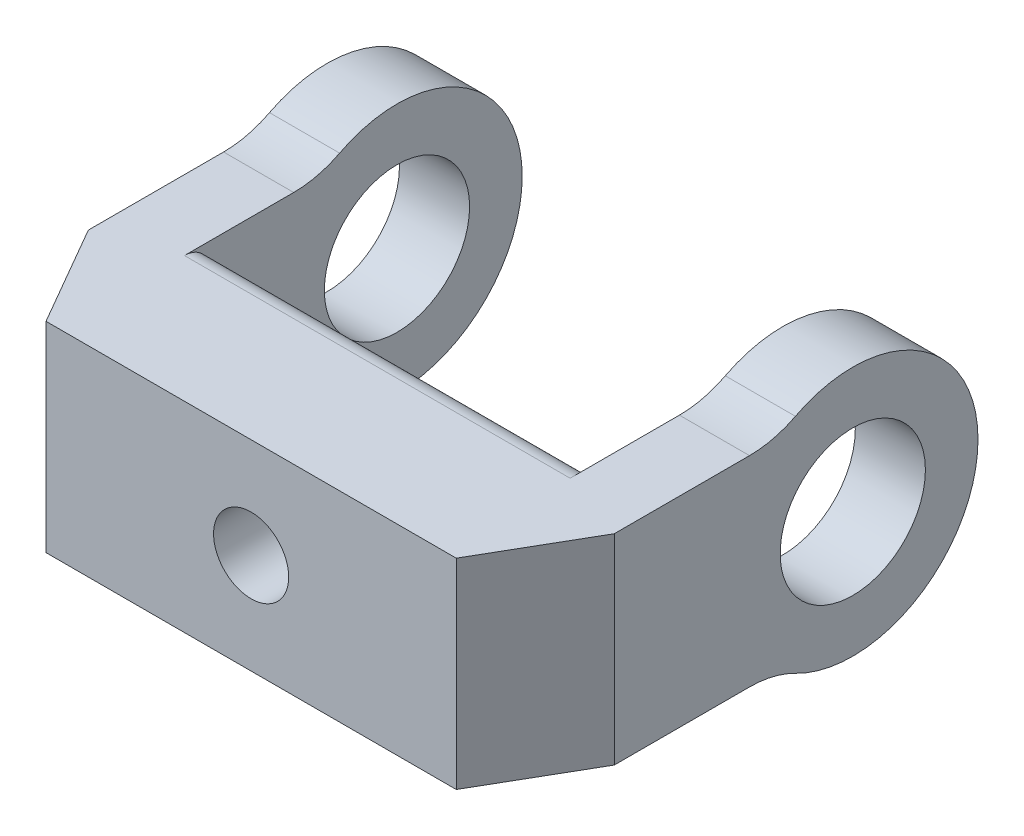
ISO-10303-21;
HEADER;
FILE_DESCRIPTION(('STEP AP214'),'2;1');
FILE_NAME('part.step','',(''),(''),'','','');
FILE_SCHEMA(('AUTOMOTIVE_DESIGN { 1 0 10303 214 1 1 1 1 }'));
ENDSEC;
DATA;
#1=APPLICATION_CONTEXT('core data for automotive mechanical design processes');
#2=APPLICATION_PROTOCOL_DEFINITION('international standard','automotive_design',2000,#1);
#3=PRODUCT_CONTEXT('',#1,'mechanical');
#4=PRODUCT('Part','Part','',(#3));
#5=PRODUCT_RELATED_PRODUCT_CATEGORY('part','',(#4));
#6=PRODUCT_DEFINITION_FORMATION('','',#4);
#7=PRODUCT_DEFINITION_CONTEXT('part definition',#1,'design');
#8=PRODUCT_DEFINITION('design','',#6,#7);
#9=PRODUCT_DEFINITION_SHAPE('','',#8);
#10=(LENGTH_UNIT() NAMED_UNIT(*) SI_UNIT(.MILLI.,.METRE.));
#11=(NAMED_UNIT(*) PLANE_ANGLE_UNIT() SI_UNIT($,.RADIAN.));
#12=(NAMED_UNIT(*) SI_UNIT($,.STERADIAN.) SOLID_ANGLE_UNIT());
#13=UNCERTAINTY_MEASURE_WITH_UNIT(LENGTH_MEASURE(1.E-05),#10,'distance_accuracy_value','');
#14=(GEOMETRIC_REPRESENTATION_CONTEXT(3) GLOBAL_UNCERTAINTY_ASSIGNED_CONTEXT((#13)) GLOBAL_UNIT_ASSIGNED_CONTEXT((#10,
#11,#12)) REPRESENTATION_CONTEXT('',''));
#15=CARTESIAN_POINT('',(0.,0.,0.));
#16=DIRECTION('',(0.,0.,1.));
#17=DIRECTION('',(1.,0.,0.));
#18=AXIS2_PLACEMENT_3D('',#15,#16,#17);
#19=CARTESIAN_POINT('',(0.,4.,-0.2));
#20=DIRECTION('',(0.,0.,1.));
#21=DIRECTION('',(1.,0.,0.));
#22=AXIS2_PLACEMENT_3D('',#19,#20,#21);
#23=CYLINDRICAL_SURFACE('',#22,2.75);
#24=CARTESIAN_POINT('',(0.,4.,-0.2));
#25=DIRECTION('',(0.,0.,-1.));
#26=DIRECTION('',(-1.,0.,0.));
#27=AXIS2_PLACEMENT_3D('',#24,#25,#26);
#28=CIRCLE('',#27,2.75);
#29=CARTESIAN_POINT('',(-2.75,4.,-0.2));
#30=VERTEX_POINT('',#29);
#31=EDGE_CURVE('E11',#30,#30,#28,.T.);
#32=ORIENTED_EDGE('',*,*,#31,.F.);
#33=EDGE_LOOP('',(#32));
#34=FACE_BOUND('',#33,.T.);
#35=CARTESIAN_POINT('',(0.,4.,2.8));
#36=DIRECTION('',(0.,0.,-1.));
#37=DIRECTION('',(-1.,0.,0.));
#38=AXIS2_PLACEMENT_3D('',#35,#36,#37);
#39=CIRCLE('',#38,2.75);
#40=CARTESIAN_POINT('',(-2.75,4.,2.8));
#41=VERTEX_POINT('',#40);
#42=EDGE_CURVE('E47',#41,#41,#39,.T.);
#43=ORIENTED_EDGE('',*,*,#42,.T.);
#44=EDGE_LOOP('',(#43));
#45=FACE_BOUND('',#44,.T.);
#46=ADVANCED_FACE('F44',(#34,#45),#23,.T.);
#47=CARTESIAN_POINT('',(0.,4.,-0.2));
#48=DIRECTION('',(0.,0.,-1.));
#49=DIRECTION('',(-1.,0.,0.));
#50=AXIS2_PLACEMENT_3D('',#47,#48,#49);
#51=PLANE('',#50);
#52=ORIENTED_EDGE('',*,*,#31,.T.);
#53=EDGE_LOOP('',(#52));
#54=FACE_BOUND('',#53,.T.);
#55=ADVANCED_FACE('F59',(#54),#51,.T.);
#56=CARTESIAN_POINT('',(0.,4.,2.8));
#57=DIRECTION('',(0.,0.,-1.));
#58=DIRECTION('',(-1.,0.,0.));
#59=AXIS2_PLACEMENT_3D('',#56,#57,#58);
#60=PLANE('',#59);
#61=ORIENTED_EDGE('',*,*,#42,.F.);
#62=EDGE_LOOP('',(#61));
#63=FACE_BOUND('',#62,.T.);
#64=ADVANCED_FACE('F57',(#63),#60,.F.);
#65=CLOSED_SHELL('',(#46,#55,#64));
#66=MANIFOLD_SOLID_BREP('B2_NOT_SHOWN',#65);
#67=CARTESIAN_POINT('',(-30.3274169979695,4.,-8.26168224299066));
#68=DIRECTION('',(1.,0.,0.));
#69=DIRECTION('',(0.,1.,0.));
#70=AXIS2_PLACEMENT_3D('',#67,#68,#69);
#71=CYLINDRICAL_SURFACE('',#70,8.);
#72=DIRECTION('',(1.,0.,0.));
#73=VECTOR('',#72,1.);
#74=CARTESIAN_POINT('',(-30.3274169979695,1.33333333333333,-0.719209910334148));
#75=LINE('',#74,#73);
#76=CARTESIAN_POINT('',(7.7,1.33333333333333,-0.719209910334148));
#77=VERTEX_POINT('',#76);
#78=CARTESIAN_POINT('',(1.37436854187254,1.33333333333333,-0.719209910334148));
#79=VERTEX_POINT('',#78);
#80=EDGE_CURVE('E230',#77,#79,#75,.F.);
#81=ORIENTED_EDGE('',*,*,#80,.T.);
#82=CARTESIAN_POINT('',(1.37436854187254,1.33333333333333,-0.719209910334148));
#83=CARTESIAN_POINT('',(1.45064290726916,1.37264778918805,-0.705313533831332));
#84=CARTESIAN_POINT('',(1.52507345791157,1.41514848642053,-0.690629883747213));
#85=CARTESIAN_POINT('',(1.66985701040067,1.50622775321314,-0.660141524678702));
#86=CARTESIAN_POINT('',(1.74021078030644,1.55480517244527,-0.644337028115957));
#87=CARTESIAN_POINT('',(1.9445595961458,1.70919341075781,-0.595926813772505));
#88=CARTESIAN_POINT('',(2.0719042774192,1.82369238638995,-0.562312435107317));
#89=CARTESIAN_POINT('',(2.30540710016194,2.07275487158565,-0.496225673168583));
#90=CARTESIAN_POINT('',(2.41156439899211,2.20731917879181,-0.463753335357209));
#91=CARTESIAN_POINT('',(2.59981347019681,2.49327301226783,-0.403497068007899));
#92=CARTESIAN_POINT('',(2.68191615915642,2.64465486316091,-0.375711014153892));
#93=CARTESIAN_POINT('',(2.81857674908921,2.95855947711137,-0.328190076092195));
#94=CARTESIAN_POINT('',(2.87342984956449,3.12094016765439,-0.30836937221502));
#95=CARTESIAN_POINT('',(2.95476735388555,3.45353628678804,-0.278625305635224));
#96=CARTESIAN_POINT('',(2.98126096727326,3.62374915319582,-0.268698729956904));
#97=CARTESIAN_POINT('',(3.00403656121541,3.95635334184611,-0.260173436898311));
#98=CARTESIAN_POINT('',(3.00200622093649,4.11861479202222,-0.260941898829235));
#99=CARTESIAN_POINT('',(2.97190203232772,4.44033080807695,-0.272188698326985));
#100=CARTESIAN_POINT('',(2.94383228134689,4.5997858115329,-0.282665508267167));
#101=CARTESIAN_POINT('',(2.86350944241337,4.90845499048188,-0.311944574667899));
#102=CARTESIAN_POINT('',(2.81171304662283,5.05780399505034,-0.330589330542769));
#103=CARTESIAN_POINT('',(2.68580784626588,5.34578998955048,-0.37434489269206));
#104=CARTESIAN_POINT('',(2.6116897343148,5.48442248070549,-0.399458395577199));
#105=CARTESIAN_POINT('',(2.43931228231947,5.75400812866875,-0.455064145225351));
#106=CARTESIAN_POINT('',(2.34009002921476,5.88430371306484,-0.485752309136465));
#107=CARTESIAN_POINT('',(2.12206030693523,6.12683258569819,-0.548558441442815));
#108=CARTESIAN_POINT('',(2.00326467655595,6.23907671161018,-0.580675537041019));
#109=CARTESIAN_POINT('',(1.79826649447429,6.40337295411356,-0.630950100888449));
#110=CARTESIAN_POINT('',(1.71729765586254,6.46188376059561,-0.649689630422438));
#111=CARTESIAN_POINT('',(1.54983807656989,6.57059317792502,-0.685713307382543));
#112=CARTESIAN_POINT('',(1.46335577686488,6.62080409145845,-0.702999589878367));
#113=CARTESIAN_POINT('',(1.37436854187257,6.66666666666666,-0.719209910334146));
#114=B_SPLINE_CURVE_WITH_KNOTS('',3,(#82,#83,#84,#85,#86,#87,#88,#89,#90,#91,#92,#93,#94,#95,
#96,#97,#98,#99,#100,#101,#102,#103,#104,#105,#106,#107,#108,#109,#110,#111,#112,#113),
.UNSPECIFIED.,.F.,.F.,(4,2,2,2,2,2,2,2,2,2,2,2,2,2,2,4),(0.,0.260607391352915,0.521165523976634,
1.04207157785956,1.56299834446671,2.08368833394413,2.59860740439107,3.11335920775131,
3.59778973762481,4.0821440543933,4.55754370124373,5.03314184841986,5.53087207243193,
6.02830234617353,6.33276425069645,6.63677073298552),.UNSPECIFIED.);
#115=CARTESIAN_POINT('',(1.37436854187257,6.66666666666666,-0.719209910334145));
#116=VERTEX_POINT('',#115);
#117=EDGE_CURVE('E213',#79,#116,#114,.T.);
#118=ORIENTED_EDGE('',*,*,#117,.T.);
#119=DIRECTION('',(1.,0.,0.));
#120=VECTOR('',#119,1.);
#121=CARTESIAN_POINT('',(-30.3274169979695,6.66666666666667,-0.719209910334146));
#122=LINE('',#121,#120);
#123=CARTESIAN_POINT('',(7.7,6.66666666666666,-0.719209910334146));
#124=VERTEX_POINT('',#123);
#125=EDGE_CURVE('E227',#116,#124,#122,.T.);
#126=ORIENTED_EDGE('',*,*,#125,.T.);
#127=CARTESIAN_POINT('',(7.7,3.99999999999999,-8.26168224299066));
#128=DIRECTION('',(-1.,0.,0.));
#129=DIRECTION('',(0.,-1.,0.));
#130=AXIS2_PLACEMENT_3D('',#127,#128,#129);
#131=CIRCLE('',#130,8.);
#132=EDGE_CURVE('E353',#77,#124,#131,.T.);
#133=ORIENTED_EDGE('',*,*,#132,.F.);
#134=EDGE_LOOP('',(#81,#118,#126,#133));
#135=FACE_BOUND('',#134,.T.);
#136=ADVANCED_FACE('F85',(#135),#71,.F.);
#137=CARTESIAN_POINT('',(-7.7,6.66666666666666,-0.719209910334146));
#138=VERTEX_POINT('',#137);
#139=CARTESIAN_POINT('',(-1.37436854187256,6.66666666666666,-0.719209910334146));
#140=VERTEX_POINT('',#139);
#141=EDGE_CURVE('E238',#138,#140,#122,.T.);
#142=ORIENTED_EDGE('',*,*,#141,.T.);
#143=CARTESIAN_POINT('',(-1.37436854187256,6.66666666666666,-0.719209910334146));
#144=CARTESIAN_POINT('',(-1.45064290726918,6.62735221081193,-0.705313533831328));
#145=CARTESIAN_POINT('',(-1.52507345791159,6.58485151357945,-0.690629883747208));
#146=CARTESIAN_POINT('',(-1.66985701040069,6.49377224678684,-0.660141524678699));
#147=CARTESIAN_POINT('',(-1.74021078030646,6.44519482755471,-0.644337028115954));
#148=CARTESIAN_POINT('',(-1.94455959614581,6.29080658924217,-0.595926813772502));
#149=CARTESIAN_POINT('',(-2.07190427741922,6.17630761361003,-0.562312435107312));
#150=CARTESIAN_POINT('',(-2.30540710016195,5.92724512841432,-0.496225673168579));
#151=CARTESIAN_POINT('',(-2.41156439899213,5.79268082120817,-0.463753335357205));
#152=CARTESIAN_POINT('',(-2.59981347019682,5.50672698773214,-0.403497068007895));
#153=CARTESIAN_POINT('',(-2.68191615915643,5.35534513683906,-0.375711014153887));
#154=CARTESIAN_POINT('',(-2.81857674908921,5.0414405228886,-0.32819007609219));
#155=CARTESIAN_POINT('',(-2.8734298495645,4.87905983234558,-0.308369372215017));
#156=CARTESIAN_POINT('',(-2.95476735388555,4.54646371321193,-0.278625305635224));
#157=CARTESIAN_POINT('',(-2.98126096727326,4.37625084680415,-0.268698729956905));
#158=CARTESIAN_POINT('',(-3.0040365612154,4.04364665815386,-0.260173436898313));
#159=CARTESIAN_POINT('',(-3.00200622093648,3.88138520797775,-0.260941898829237));
#160=CARTESIAN_POINT('',(-2.97190203232771,3.55966919192302,-0.272188698326989));
#161=CARTESIAN_POINT('',(-2.94383228134688,3.40021418846707,-0.282665508267171));
#162=CARTESIAN_POINT('',(-2.86350944241335,3.0915450095181,-0.311944574667903));
#163=CARTESIAN_POINT('',(-2.81171304662281,2.94219600494963,-0.330589330542772));
#164=CARTESIAN_POINT('',(-2.68580784626586,2.65421001044949,-0.374344892692062));
#165=CARTESIAN_POINT('',(-2.61168973431478,2.51557751929448,-0.399458395577203));
#166=CARTESIAN_POINT('',(-2.43931228231945,2.24599187133123,-0.455064145225356));
#167=CARTESIAN_POINT('',(-2.34009002921474,2.11569628693514,-0.48575230913647));
#168=CARTESIAN_POINT('',(-2.1220603069352,1.87316741430179,-0.548558441442818));
#169=CARTESIAN_POINT('',(-2.00326467655593,1.7609232883898,-0.580675537041022));
#170=CARTESIAN_POINT('',(-1.79826649447425,1.59662704588642,-0.630950100888452));
#171=CARTESIAN_POINT('',(-1.71729765586251,1.53811623940438,-0.649689630422442));
#172=CARTESIAN_POINT('',(-1.54983807656986,1.42940682207496,-0.685713307382548));
#173=CARTESIAN_POINT('',(-1.46335577686485,1.37919590854153,-0.702999589878372));
#174=CARTESIAN_POINT('',(-1.37436854187254,1.33333333333333,-0.719209910334149));
#175=B_SPLINE_CURVE_WITH_KNOTS('',3,(#143,#144,#145,#146,#147,#148,#149,#150,#151,#152,#153,
#154,#155,#156,#157,#158,#159,#160,#161,#162,#163,#164,#165,#166,#167,#168,#169,#170,#171,#172,
#173,#174),.UNSPECIFIED.,.F.,.F.,(4,2,2,2,2,2,2,2,2,2,2,2,2,2,2,4),(0.,0.260607391352916,
0.521165523976635,1.04207157785956,1.56299834446671,2.08368833394413,2.59860740439108,
3.11335920775131,3.5977897376248,4.08214405439329,4.55754370124373,5.03314184841986,
5.53087207243193,6.02830234617353,6.33276425069645,6.63677073298553),.UNSPECIFIED.);
#176=CARTESIAN_POINT('',(-1.37436854187254,1.33333333333333,-0.719209910334148));
#177=VERTEX_POINT('',#176);
#178=EDGE_CURVE('E216',#140,#177,#175,.T.);
#179=ORIENTED_EDGE('',*,*,#178,.T.);
#180=CARTESIAN_POINT('',(-7.7,1.33333333333333,-0.719209910334148));
#181=VERTEX_POINT('',#180);
#182=EDGE_CURVE('E241',#177,#181,#75,.F.);
#183=ORIENTED_EDGE('',*,*,#182,.T.);
#184=CARTESIAN_POINT('',(-7.7,4.,-8.26168224299066));
#185=DIRECTION('',(-1.,0.,0.));
#186=DIRECTION('',(0.,0.,1.));
#187=AXIS2_PLACEMENT_3D('',#184,#185,#186);
#188=CIRCLE('',#187,8.);
#189=EDGE_CURVE('E348',#181,#138,#188,.T.);
#190=ORIENTED_EDGE('',*,*,#189,.T.);
#191=EDGE_LOOP('',(#142,#179,#183,#190));
#192=FACE_BOUND('',#191,.T.);
#193=ADVANCED_FACE('F304',(#192),#71,.F.);
#194=CARTESIAN_POINT('',(-30.3274169979695,1.,0.223599131247915));
#195=DIRECTION('',(1.,0.,0.));
#196=DIRECTION('',(0.,1.,0.));
#197=AXIS2_PLACEMENT_3D('',#194,#195,#196);
#198=CYLINDRICAL_SURFACE('',#197,1.);
#199=ORIENTED_EDGE('',*,*,#182,.F.);
#200=CARTESIAN_POINT('',(-1.37436854187254,1.33333333333333,-0.719209910334148));
#201=CARTESIAN_POINT('',(-1.34383093339248,1.31759348896181,-0.724771788693334));
#202=CARTESIAN_POINT('',(-1.31294254777848,1.30233913486402,-0.729725033961236));
#203=CARTESIAN_POINT('',(-1.25054428149426,1.27285346975205,-0.738580153536468));
#204=CARTESIAN_POINT('',(-1.21903459686126,1.25862184241912,-0.742482353956093));
#205=CARTESIAN_POINT('',(-1.12375538851866,1.2175638991892,-0.752855750174692));
#206=CARTESIAN_POINT('',(-1.0591483139847,1.19232941861632,-0.758008628039157));
#207=CARTESIAN_POINT('',(-0.9284343067971,1.14644144372705,-0.765892881860939));
#208=CARTESIAN_POINT('',(-0.862332713786548,1.12577382995788,-0.768631801862698));
#209=CARTESIAN_POINT('',(-0.728794428754367,1.08904558368088,-0.772599622694828));
#210=CARTESIAN_POINT('',(-0.661357249144274,1.07298666811425,-0.77382796132611));
#211=CARTESIAN_POINT('',(-0.521124049966809,1.04468742008785,-0.775509196421391));
#212=CARTESIAN_POINT('',(-0.448263848874995,1.03276178906302,-0.775906714079151));
#213=CARTESIAN_POINT('',(-0.301860866979945,1.01431347508757,-0.776340926680994));
#214=CARTESIAN_POINT('',(-0.228318064477247,1.00779096449765,-0.776377610114793));
#215=CARTESIAN_POINT('',(-0.0807809906604971,1.00017617497867,-0.776408259046013));
#216=CARTESIAN_POINT('',(-0.00678606942832134,0.999096448226243,-0.776402125877105));
#217=CARTESIAN_POINT('',(0.141080673630081,1.00240666010918,-0.776399046871483));
#218=CARTESIAN_POINT('',(0.214952492832866,1.00679671385599,-0.776402101228123));
#219=CARTESIAN_POINT('',(0.372666615055302,1.02203802921477,-0.776192161182604));
#220=CARTESIAN_POINT('',(0.456429780761182,1.03372080706698,-0.775948320322494));
#221=CARTESIAN_POINT('',(0.622703908795433,1.06412107231519,-0.774458725203348));
#222=CARTESIAN_POINT('',(0.70521427316135,1.08284181552417,-0.773212506932859));
#223=CARTESIAN_POINT('',(0.867994329025678,1.12707918807268,-0.768542014479608));
#224=CARTESIAN_POINT('',(0.948271382430035,1.15256955567344,-0.765126087569134));
#225=CARTESIAN_POINT('',(1.106132570922,1.21010621753436,-0.754517352551756));
#226=CARTESIAN_POINT('',(1.18371992171641,1.24214434345826,-0.747329232911614));
#227=CARTESIAN_POINT('',(1.2788850561262,1.28616288207954,-0.734626659730996));
#228=CARTESIAN_POINT('',(1.29816228041298,1.29533183513767,-0.731845928067095));
#229=CARTESIAN_POINT('',(1.33646056184725,1.31405015951348,-0.725858322582068));
#230=CARTESIAN_POINT('',(1.35548165525823,1.32359947620446,-0.722651509800056));
#231=CARTESIAN_POINT('',(1.37436854187267,1.33333333333333,-0.719209910335116));
#232=B_SPLINE_CURVE_WITH_KNOTS('',3,(#200,#201,#202,#203,#204,#205,#206,#207,#208,#209,#210,
#211,#212,#213,#214,#215,#216,#217,#218,#219,#220,#221,#222,#223,#224,#225,#226,#227,#228,#229,
#230,#231),.UNSPECIFIED.,.F.,.F.,(4,2,2,2,2,2,2,2,2,2,2,2,2,2,2,4),(0.,0.104382478785225,
0.208732532954638,0.417135285757512,0.624884409858492,0.832710829402461,1.05399824368181,
1.27529271680504,1.49709730766674,1.71890656648106,1.9723210753254,2.22585296007386,
2.47841531999718,2.73066451048409,2.79523900425507,2.85980425722998),.UNSPECIFIED.);
#233=EDGE_CURVE('E231',#177,#79,#232,.T.);
#234=ORIENTED_EDGE('',*,*,#233,.T.);
#235=ORIENTED_EDGE('',*,*,#80,.F.);
#236=CARTESIAN_POINT('',(7.7,0.999999999999992,0.223599131247915));
#237=DIRECTION('',(1.,0.,0.));
#238=DIRECTION('',(0.,1.,0.));
#239=AXIS2_PLACEMENT_3D('',#236,#237,#238);
#240=CIRCLE('',#239,1.);
#241=CARTESIAN_POINT('',(7.7,0.,0.223599131247915));
#242=VERTEX_POINT('',#241);
#243=EDGE_CURVE('E251',#242,#77,#240,.T.);
#244=ORIENTED_EDGE('',*,*,#243,.F.);
#245=DIRECTION('',(1.,0.,0.));
#246=VECTOR('',#245,1.);
#247=CARTESIAN_POINT('',(0.,0.,0.223599131247915));
#248=LINE('',#247,#246);
#249=CARTESIAN_POINT('',(-7.7,0.,0.223599131247915));
#250=VERTEX_POINT('',#249);
#251=EDGE_CURVE('E239',#250,#242,#248,.T.);
#252=ORIENTED_EDGE('',*,*,#251,.F.);
#253=CARTESIAN_POINT('',(-7.7,0.999999999999995,0.223599131247915));
#254=DIRECTION('',(-1.,0.,0.));
#255=DIRECTION('',(0.,0.,1.));
#256=AXIS2_PLACEMENT_3D('',#253,#254,#255);
#257=CIRCLE('',#256,1.);
#258=EDGE_CURVE('E253',#181,#250,#257,.T.);
#259=ORIENTED_EDGE('',*,*,#258,.F.);
#260=EDGE_LOOP('',(#199,#234,#235,#244,#252,#259));
#261=FACE_BOUND('',#260,.T.);
#262=ADVANCED_FACE('F334',(#261),#198,.T.);
#263=CARTESIAN_POINT('',(-30.3274169979695,7.,0.223599131247918));
#264=DIRECTION('',(1.,0.,0.));
#265=DIRECTION('',(0.,1.,0.));
#266=AXIS2_PLACEMENT_3D('',#263,#264,#265);
#267=CYLINDRICAL_SURFACE('',#266,1.);
#268=ORIENTED_EDGE('',*,*,#125,.F.);
#269=CARTESIAN_POINT('',(1.37436854187257,6.66666666666666,-0.719209910334145));
#270=CARTESIAN_POINT('',(1.34383093339251,6.68240651103818,-0.72477178869333));
#271=CARTESIAN_POINT('',(1.31294254777851,6.69766086513597,-0.729725033961232));
#272=CARTESIAN_POINT('',(1.2505442814943,6.72714653024794,-0.738580153536464));
#273=CARTESIAN_POINT('',(1.2190345968613,6.74137815758087,-0.742482353956089));
#274=CARTESIAN_POINT('',(1.1237553885187,6.78243610081079,-0.752855750174689));
#275=CARTESIAN_POINT('',(1.05914831398474,6.80767058138367,-0.758008628039154));
#276=CARTESIAN_POINT('',(0.928434306797141,6.85355855627294,-0.765892881860936));
#277=CARTESIAN_POINT('',(0.86233271378659,6.87422617004211,-0.768631801862695));
#278=CARTESIAN_POINT('',(0.728794428754411,6.91095441631911,-0.772599622694825));
#279=CARTESIAN_POINT('',(0.661357249144318,6.92701333188574,-0.773827961326108));
#280=CARTESIAN_POINT('',(0.521124049966855,6.95531257991214,-0.775509196421388));
#281=CARTESIAN_POINT('',(0.448263848875042,6.96723821093697,-0.775906714079148));
#282=CARTESIAN_POINT('',(0.301860866979993,6.98568652491242,-0.776340926680991));
#283=CARTESIAN_POINT('',(0.228318064477296,6.99220903550235,-0.77637761011479));
#284=CARTESIAN_POINT('',(0.0807809906605467,6.99982382502133,-0.776408259046009));
#285=CARTESIAN_POINT('',(0.00678606942837144,7.00090355177376,-0.776402125877101));
#286=CARTESIAN_POINT('',(-0.14108067363003,6.99759333989082,-0.77639904687148));
#287=CARTESIAN_POINT('',(-0.214952492832815,6.99320328614401,-0.776402101228119));
#288=CARTESIAN_POINT('',(-0.37266661505525,6.97796197078523,-0.776192161182601));
#289=CARTESIAN_POINT('',(-0.456429780761131,6.96627919293303,-0.775948320322492));
#290=CARTESIAN_POINT('',(-0.622703908795383,6.93587892768482,-0.774458725203347));
#291=CARTESIAN_POINT('',(-0.705214273161299,6.91715818447584,-0.773212506932858));
#292=CARTESIAN_POINT('',(-0.867994329025627,6.87292081192733,-0.768542014479608));
#293=CARTESIAN_POINT('',(-0.948271382429985,6.84743044432657,-0.765126087569134));
#294=CARTESIAN_POINT('',(-1.10613257092195,6.78989378246565,-0.754517352551759));
#295=CARTESIAN_POINT('',(-1.18371992171636,6.75785565654176,-0.747329232911619));
#296=CARTESIAN_POINT('',(-1.27888505612617,6.71383711792047,-0.734626659731));
#297=CARTESIAN_POINT('',(-1.29816228041296,6.70466816486234,-0.731845928067099));
#298=CARTESIAN_POINT('',(-1.33646056184725,6.68594984048652,-0.725858322582068));
#299=CARTESIAN_POINT('',(-1.35548165525824,6.67640052379554,-0.722651509800055));
#300=CARTESIAN_POINT('',(-1.37436854187269,6.66666666666666,-0.719209910335113));
#301=B_SPLINE_CURVE_WITH_KNOTS('',3,(#269,#270,#271,#272,#273,#274,#275,#276,#277,#278,#279,
#280,#281,#282,#283,#284,#285,#286,#287,#288,#289,#290,#291,#292,#293,#294,#295,#296,#297,#298,
#299,#300),.UNSPECIFIED.,.F.,.F.,(4,2,2,2,2,2,2,2,2,2,2,2,2,2,2,4),(0.,0.104382478785225,
0.208732532954635,0.417135285757508,0.624884409858485,0.832710829402453,1.0539982436818,
1.27529271680503,1.49709730766673,1.71890656648104,1.97232107532539,2.22585296007385,
2.47841531999717,2.73066451048408,2.7952390042551,2.85980425723004),.UNSPECIFIED.);
#302=EDGE_CURVE('E209',#116,#140,#301,.T.);
#303=ORIENTED_EDGE('',*,*,#302,.T.);
#304=ORIENTED_EDGE('',*,*,#141,.F.);
#305=CARTESIAN_POINT('',(-7.7,6.99999999999999,0.223599131247918));
#306=DIRECTION('',(-1.,0.,0.));
#307=DIRECTION('',(0.,0.,1.));
#308=AXIS2_PLACEMENT_3D('',#305,#306,#307);
#309=CIRCLE('',#308,1.);
#310=CARTESIAN_POINT('',(-7.7,8.,0.223599131247918));
#311=VERTEX_POINT('',#310);
#312=EDGE_CURVE('E222',#311,#138,#309,.T.);
#313=ORIENTED_EDGE('',*,*,#312,.F.);
#314=DIRECTION('',(-1.,0.,0.));
#315=VECTOR('',#314,1.);
#316=CARTESIAN_POINT('',(-7.7,8.,0.223599131247918));
#317=LINE('',#316,#315);
#318=CARTESIAN_POINT('',(7.7,8.,0.223599131247918));
#319=VERTEX_POINT('',#318);
#320=EDGE_CURVE('E248',#319,#311,#317,.T.);
#321=ORIENTED_EDGE('',*,*,#320,.F.);
#322=CARTESIAN_POINT('',(7.7,6.99999999999999,0.223599131247918));
#323=DIRECTION('',(1.,0.,0.));
#324=DIRECTION('',(0.,1.,0.));
#325=AXIS2_PLACEMENT_3D('',#322,#323,#324);
#326=CIRCLE('',#325,1.);
#327=EDGE_CURVE('E236',#124,#319,#326,.T.);
#328=ORIENTED_EDGE('',*,*,#327,.F.);
#329=EDGE_LOOP('',(#268,#303,#304,#313,#321,#328));
#330=FACE_BOUND('',#329,.T.);
#331=ADVANCED_FACE('F233',(#330),#267,.T.);
#332=CARTESIAN_POINT('',(0.,8.,0.));
#333=DIRECTION('',(0.,-1.,0.));
#334=DIRECTION('',(0.,0.,-1.));
#335=AXIS2_PLACEMENT_3D('',#332,#333,#334);
#336=PLANE('',#335);
#337=DIRECTION('',(0.,0.,1.));
#338=VECTOR('',#337,1.);
#339=CARTESIAN_POINT('',(-7.7,8.,-12.2616822429907));
#340=LINE('',#339,#338);
#341=CARTESIAN_POINT('',(-7.7,8.,-4.13857661737299));
#342=VERTEX_POINT('',#341);
#343=EDGE_CURVE('E374',#342,#311,#340,.T.);
#344=ORIENTED_EDGE('',*,*,#343,.F.);
#345=DIRECTION('',(-1.,0.,0.));
#346=VECTOR('',#345,1.);
#347=CARTESIAN_POINT('',(0.,8.,-4.13857661737299));
#348=LINE('',#347,#346);
#349=CARTESIAN_POINT('',(-10.5,8.,-4.13857661737299));
#350=VERTEX_POINT('',#349);
#351=EDGE_CURVE('E610',#342,#350,#348,.T.);
#352=ORIENTED_EDGE('',*,*,#351,.T.);
#353=DIRECTION('',(0.,0.,1.));
#354=VECTOR('',#353,1.);
#355=CARTESIAN_POINT('',(-10.5,8.,2.26168224299065));
#356=LINE('',#355,#354);
#357=CARTESIAN_POINT('',(-10.5,8.,1.26168224299063));
#358=VERTEX_POINT('',#357);
#359=EDGE_CURVE('E243',#350,#358,#356,.T.);
#360=ORIENTED_EDGE('',*,*,#359,.T.);
#361=DIRECTION('',(0.499999999999998,0.,0.86602540378444));
#362=VECTOR('',#361,1.);
#363=CARTESIAN_POINT('',(-8.19059892324149,8.,5.26168224299065));
#364=LINE('',#363,#362);
#365=CARTESIAN_POINT('',(-8.19059892324148,8.,5.26168224299065));
#366=VERTEX_POINT('',#365);
#367=EDGE_CURVE('E666',#358,#366,#364,.T.);
#368=ORIENTED_EDGE('',*,*,#367,.T.);
#369=DIRECTION('',(-1.,0.,0.));
#370=VECTOR('',#369,1.);
#371=CARTESIAN_POINT('',(10.5,8.,5.26168224299065));
#372=LINE('',#371,#370);
#373=CARTESIAN_POINT('',(8.1905989232415,8.,5.26168224299065));
#374=VERTEX_POINT('',#373);
#375=EDGE_CURVE('E358',#374,#366,#372,.T.);
#376=ORIENTED_EDGE('',*,*,#375,.F.);
#377=DIRECTION('',(0.499999999999998,0.,-0.86602540378444));
#378=VECTOR('',#377,1.);
#379=CARTESIAN_POINT('',(8.1905989232415,8.,5.26168224299065));
#380=LINE('',#379,#378);
#381=CARTESIAN_POINT('',(10.5,8.,1.26168224299063));
#382=VERTEX_POINT('',#381);
#383=EDGE_CURVE('E670',#374,#382,#380,.T.);
#384=ORIENTED_EDGE('',*,*,#383,.T.);
#385=DIRECTION('',(0.,0.,-1.));
#386=VECTOR('',#385,1.);
#387=CARTESIAN_POINT('',(10.5,8.,2.26168224299065));
#388=LINE('',#387,#386);
#389=CARTESIAN_POINT('',(10.5,8.,-4.13857661737299));
#390=VERTEX_POINT('',#389);
#391=EDGE_CURVE('E377',#382,#390,#388,.T.);
#392=ORIENTED_EDGE('',*,*,#391,.T.);
#393=DIRECTION('',(1.,0.,0.));
#394=VECTOR('',#393,1.);
#395=CARTESIAN_POINT('',(0.,8.,-4.13857661737299));
#396=LINE('',#395,#394);
#397=CARTESIAN_POINT('',(7.7,8.,-4.138576617373));
#398=VERTEX_POINT('',#397);
#399=EDGE_CURVE('E608',#390,#398,#396,.F.);
#400=ORIENTED_EDGE('',*,*,#399,.T.);
#401=DIRECTION('',(0.,0.,1.));
#402=VECTOR('',#401,1.);
#403=CARTESIAN_POINT('',(7.7,8.,-12.2616822429907));
#404=LINE('',#403,#402);
#405=EDGE_CURVE('E368',#398,#319,#404,.T.);
#406=ORIENTED_EDGE('',*,*,#405,.T.);
#407=ORIENTED_EDGE('',*,*,#320,.T.);
#408=EDGE_LOOP('',(#344,#352,#360,#368,#376,#384,#392,#400,#406,#407));
#409=FACE_BOUND('',#408,.T.);
#410=ADVANCED_FACE('F321',(#409),#336,.F.);
#411=CARTESIAN_POINT('',(0.,0.,0.));
#412=DIRECTION('',(0.,-1.,0.));
#413=DIRECTION('',(0.,0.,-1.));
#414=AXIS2_PLACEMENT_3D('',#411,#412,#413);
#415=PLANE('',#414);
#416=DIRECTION('',(0.,0.,1.));
#417=VECTOR('',#416,1.);
#418=CARTESIAN_POINT('',(-10.5,0.,2.26168224299065));
#419=LINE('',#418,#417);
#420=CARTESIAN_POINT('',(-10.5,0.,-4.13857661737298));
#421=VERTEX_POINT('',#420);
#422=CARTESIAN_POINT('',(-10.5,0.,1.26168224299063));
#423=VERTEX_POINT('',#422);
#424=EDGE_CURVE('E379',#421,#423,#419,.T.);
#425=ORIENTED_EDGE('',*,*,#424,.F.);
#426=DIRECTION('',(1.,0.,0.));
#427=VECTOR('',#426,1.);
#428=CARTESIAN_POINT('',(-7.7,0.,-4.13857661737299));
#429=LINE('',#428,#427);
#430=CARTESIAN_POINT('',(-7.7,0.,-4.13857661737299));
#431=VERTEX_POINT('',#430);
#432=EDGE_CURVE('E686',#421,#431,#429,.T.);
#433=ORIENTED_EDGE('',*,*,#432,.T.);
#434=DIRECTION('',(0.,0.,1.));
#435=VECTOR('',#434,1.);
#436=CARTESIAN_POINT('',(-7.7,0.,-12.2616822429907));
#437=LINE('',#436,#435);
#438=EDGE_CURVE('E372',#431,#250,#437,.T.);
#439=ORIENTED_EDGE('',*,*,#438,.T.);
#440=ORIENTED_EDGE('',*,*,#251,.T.);
#441=DIRECTION('',(0.,0.,1.));
#442=VECTOR('',#441,1.);
#443=CARTESIAN_POINT('',(7.7,0.,-12.2616822429907));
#444=LINE('',#443,#442);
#445=CARTESIAN_POINT('',(7.7,0.,-4.13857661737299));
#446=VERTEX_POINT('',#445);
#447=EDGE_CURVE('E370',#446,#242,#444,.T.);
#448=ORIENTED_EDGE('',*,*,#447,.F.);
#449=DIRECTION('',(-1.,0.,0.));
#450=VECTOR('',#449,1.);
#451=CARTESIAN_POINT('',(10.5,0.,-4.13857661737299));
#452=LINE('',#451,#450);
#453=CARTESIAN_POINT('',(10.5,0.,-4.13857661737299));
#454=VERTEX_POINT('',#453);
#455=EDGE_CURVE('E684',#446,#454,#452,.F.);
#456=ORIENTED_EDGE('',*,*,#455,.T.);
#457=DIRECTION('',(0.,0.,-1.));
#458=VECTOR('',#457,1.);
#459=CARTESIAN_POINT('',(10.5,0.,2.26168224299065));
#460=LINE('',#459,#458);
#461=CARTESIAN_POINT('',(10.5,0.,1.26168224299063));
#462=VERTEX_POINT('',#461);
#463=EDGE_CURVE('E376',#462,#454,#460,.T.);
#464=ORIENTED_EDGE('',*,*,#463,.F.);
#465=DIRECTION('',(-0.499999999999998,0.,0.86602540378444));
#466=VECTOR('',#465,1.);
#467=CARTESIAN_POINT('',(8.42132443696683,0.,4.86205393061595));
#468=LINE('',#467,#466);
#469=CARTESIAN_POINT('',(8.19059892324149,0.,5.26168224299065));
#470=VERTEX_POINT('',#469);
#471=EDGE_CURVE('E663',#462,#470,#468,.T.);
#472=ORIENTED_EDGE('',*,*,#471,.T.);
#473=DIRECTION('',(1.,0.,0.));
#474=VECTOR('',#473,1.);
#475=CARTESIAN_POINT('',(-10.5,0.,5.26168224299065));
#476=LINE('',#475,#474);
#477=CARTESIAN_POINT('',(-8.19059892324149,0.,5.26168224299065));
#478=VERTEX_POINT('',#477);
#479=EDGE_CURVE('E690',#478,#470,#476,.T.);
#480=ORIENTED_EDGE('',*,*,#479,.F.);
#481=DIRECTION('',(-0.499999999999998,0.,-0.86602540378444));
#482=VECTOR('',#481,1.);
#483=CARTESIAN_POINT('',(-8.42132443696682,0.,4.86205393061595));
#484=LINE('',#483,#482);
#485=EDGE_CURVE('E678',#478,#423,#484,.T.);
#486=ORIENTED_EDGE('',*,*,#485,.T.);
#487=EDGE_LOOP('',(#425,#433,#439,#440,#448,#456,#464,#472,#480,#486));
#488=FACE_BOUND('',#487,.T.);
#489=ADVANCED_FACE('F324',(#488),#415,.T.);
#490=CARTESIAN_POINT('',(10.5,8.,2.26168224299065));
#491=DIRECTION('',(-1.,0.,0.));
#492=DIRECTION('',(0.,0.,1.));
#493=AXIS2_PLACEMENT_3D('',#490,#491,#492);
#494=PLANE('',#493);
#495=ORIENTED_EDGE('',*,*,#463,.T.);
#496=CARTESIAN_POINT('',(10.5,-4.,-4.13857661737299));
#497=DIRECTION('',(-1.,0.,0.));
#498=DIRECTION('',(0.,0.,1.));
#499=AXIS2_PLACEMENT_3D('',#496,#497,#498);
#500=CIRCLE('',#499,4.);
#501=CARTESIAN_POINT('',(10.5,-0.444444444444445,-5.9710680065364));
#502=VERTEX_POINT('',#501);
#503=EDGE_CURVE('E625',#454,#502,#500,.T.);
#504=ORIENTED_EDGE('',*,*,#503,.T.);
#505=CARTESIAN_POINT('',(10.5,4.,-8.26168224299066));
#506=DIRECTION('',(1.,0.,0.));
#507=DIRECTION('',(0.,0.,-1.));
#508=AXIS2_PLACEMENT_3D('',#505,#506,#507);
#509=CIRCLE('',#508,5.);
#510=CARTESIAN_POINT('',(10.5,8.44444444444444,-5.9710680065364));
#511=VERTEX_POINT('',#510);
#512=EDGE_CURVE('E635',#502,#511,#509,.T.);
#513=ORIENTED_EDGE('',*,*,#512,.T.);
#514=CARTESIAN_POINT('',(10.5,12.,-4.13857661737299));
#515=DIRECTION('',(-1.,0.,0.));
#516=DIRECTION('',(0.,0.,1.));
#517=AXIS2_PLACEMENT_3D('',#514,#515,#516);
#518=CIRCLE('',#517,4.);
#519=EDGE_CURVE('E42',#511,#390,#518,.T.);
#520=ORIENTED_EDGE('',*,*,#519,.T.);
#521=ORIENTED_EDGE('',*,*,#391,.F.);
#522=DIRECTION('',(0.,-1.,0.));
#523=VECTOR('',#522,1.);
#524=CARTESIAN_POINT('',(10.5,0.,1.26168224299063));
#525=LINE('',#524,#523);
#526=EDGE_CURVE('E673',#382,#462,#525,.T.);
#527=ORIENTED_EDGE('',*,*,#526,.T.);
#528=EDGE_LOOP('',(#495,#504,#513,#520,#521,#527));
#529=FACE_BOUND('',#528,.T.);
#530=CARTESIAN_POINT('',(10.5,4.,-8.26168224299066));
#531=DIRECTION('',(1.,0.,0.));
#532=DIRECTION('',(0.,0.,-1.));
#533=AXIS2_PLACEMENT_3D('',#530,#531,#532);
#534=CIRCLE('',#533,2.9);
#535=CARTESIAN_POINT('',(10.5,4.,-11.1616822429907));
#536=VERTEX_POINT('',#535);
#537=EDGE_CURVE('E352',#536,#536,#534,.T.);
#538=ORIENTED_EDGE('',*,*,#537,.F.);
#539=EDGE_LOOP('',(#538));
#540=FACE_BOUND('',#539,.T.);
#541=ADVANCED_FACE('F328',(#529,#540),#494,.F.);
#542=CARTESIAN_POINT('',(-10.5,8.,2.26168224299065));
#543=DIRECTION('',(1.,0.,0.));
#544=DIRECTION('',(0.,0.,-1.));
#545=AXIS2_PLACEMENT_3D('',#542,#543,#544);
#546=PLANE('',#545);
#547=ORIENTED_EDGE('',*,*,#359,.F.);
#548=CARTESIAN_POINT('',(-10.5,12.,-4.13857661737299));
#549=DIRECTION('',(1.,0.,0.));
#550=DIRECTION('',(0.,0.,-1.));
#551=AXIS2_PLACEMENT_3D('',#548,#549,#550);
#552=CIRCLE('',#551,4.);
#553=CARTESIAN_POINT('',(-10.5,8.44444444444444,-5.9710680065364));
#554=VERTEX_POINT('',#553);
#555=EDGE_CURVE('E627',#350,#554,#552,.T.);
#556=ORIENTED_EDGE('',*,*,#555,.T.);
#557=CARTESIAN_POINT('',(-10.5,4.,-8.26168224299066));
#558=DIRECTION('',(-1.,0.,0.));
#559=DIRECTION('',(0.,0.,1.));
#560=AXIS2_PLACEMENT_3D('',#557,#558,#559);
#561=CIRCLE('',#560,5.);
#562=CARTESIAN_POINT('',(-10.5,-0.444444444444446,-5.97106800653639));
#563=VERTEX_POINT('',#562);
#564=EDGE_CURVE('E641',#554,#563,#561,.T.);
#565=ORIENTED_EDGE('',*,*,#564,.T.);
#566=CARTESIAN_POINT('',(-10.5,-4.,-4.13857661737299));
#567=DIRECTION('',(1.,0.,0.));
#568=DIRECTION('',(0.,0.,-1.));
#569=AXIS2_PLACEMENT_3D('',#566,#567,#568);
#570=CIRCLE('',#569,4.);
#571=EDGE_CURVE('E614',#563,#421,#570,.T.);
#572=ORIENTED_EDGE('',*,*,#571,.T.);
#573=ORIENTED_EDGE('',*,*,#424,.T.);
#574=DIRECTION('',(0.,1.,0.));
#575=VECTOR('',#574,1.);
#576=CARTESIAN_POINT('',(-10.5,8.,1.26168224299063));
#577=LINE('',#576,#575);
#578=EDGE_CURVE('E659',#423,#358,#577,.T.);
#579=ORIENTED_EDGE('',*,*,#578,.T.);
#580=EDGE_LOOP('',(#547,#556,#565,#572,#573,#579));
#581=FACE_BOUND('',#580,.T.);
#582=CARTESIAN_POINT('',(-10.5,4.,-8.26168224299066));
#583=DIRECTION('',(1.,0.,0.));
#584=DIRECTION('',(0.,0.,-1.));
#585=AXIS2_PLACEMENT_3D('',#582,#583,#584);
#586=CIRCLE('',#585,2.9);
#587=CARTESIAN_POINT('',(-10.5,4.,-11.1616822429907));
#588=VERTEX_POINT('',#587);
#589=EDGE_CURVE('E365',#588,#588,#586,.T.);
#590=ORIENTED_EDGE('',*,*,#589,.T.);
#591=EDGE_LOOP('',(#590));
#592=FACE_BOUND('',#591,.T.);
#593=ADVANCED_FACE('F319',(#581,#592),#546,.F.);
#594=CARTESIAN_POINT('',(-7.7,8.,-12.2616822429907));
#595=DIRECTION('',(-1.,0.,0.));
#596=DIRECTION('',(0.,0.,1.));
#597=AXIS2_PLACEMENT_3D('',#594,#595,#596);
#598=PLANE('',#597);
#599=ORIENTED_EDGE('',*,*,#438,.F.);
#600=CARTESIAN_POINT('',(-7.7,-4.,-4.13857661737299));
#601=DIRECTION('',(-1.,0.,0.));
#602=DIRECTION('',(0.,0.,1.));
#603=AXIS2_PLACEMENT_3D('',#600,#601,#602);
#604=CIRCLE('',#603,4.);
#605=CARTESIAN_POINT('',(-7.7,-0.444444444444446,-5.97106800653639));
#606=VERTEX_POINT('',#605);
#607=EDGE_CURVE('E621',#431,#606,#604,.T.);
#608=ORIENTED_EDGE('',*,*,#607,.T.);
#609=CARTESIAN_POINT('',(-7.7,4.,-8.26168224299066));
#610=DIRECTION('',(-1.,0.,0.));
#611=DIRECTION('',(0.,0.,1.));
#612=AXIS2_PLACEMENT_3D('',#609,#610,#611);
#613=CIRCLE('',#612,5.);
#614=CARTESIAN_POINT('',(-7.7,8.44444444444444,-5.9710680065364));
#615=VERTEX_POINT('',#614);
#616=EDGE_CURVE('E638',#606,#615,#613,.F.);
#617=ORIENTED_EDGE('',*,*,#616,.T.);
#618=CARTESIAN_POINT('',(-7.7,12.,-4.13857661737299));
#619=DIRECTION('',(-1.,0.,0.));
#620=DIRECTION('',(0.,0.,1.));
#621=AXIS2_PLACEMENT_3D('',#618,#619,#620);
#622=CIRCLE('',#621,4.);
#623=EDGE_CURVE('E629',#615,#342,#622,.T.);
#624=ORIENTED_EDGE('',*,*,#623,.T.);
#625=ORIENTED_EDGE('',*,*,#343,.T.);
#626=ORIENTED_EDGE('',*,*,#312,.T.);
#627=ORIENTED_EDGE('',*,*,#189,.F.);
#628=ORIENTED_EDGE('',*,*,#258,.T.);
#629=EDGE_LOOP('',(#599,#608,#617,#624,#625,#626,#627,#628));
#630=FACE_BOUND('',#629,.T.);
#631=CARTESIAN_POINT('',(-7.7,4.,-8.26168224299066));
#632=DIRECTION('',(-1.,0.,0.));
#633=DIRECTION('',(0.,0.,1.));
#634=AXIS2_PLACEMENT_3D('',#631,#632,#633);
#635=CIRCLE('',#634,2.9);
#636=CARTESIAN_POINT('',(-7.7,4.,-5.36168224299066));
#637=VERTEX_POINT('',#636);
#638=EDGE_CURVE('E362',#637,#637,#635,.T.);
#639=ORIENTED_EDGE('',*,*,#638,.T.);
#640=EDGE_LOOP('',(#639));
#641=FACE_BOUND('',#640,.T.);
#642=ADVANCED_FACE('F315',(#630,#641),#598,.F.);
#643=CARTESIAN_POINT('',(7.7,8.,-12.2616822429907));
#644=DIRECTION('',(1.,0.,0.));
#645=DIRECTION('',(0.,1.,0.));
#646=AXIS2_PLACEMENT_3D('',#643,#644,#645);
#647=PLANE('',#646);
#648=ORIENTED_EDGE('',*,*,#405,.F.);
#649=CARTESIAN_POINT('',(7.7,12.,-4.13857661737299));
#650=DIRECTION('',(1.,0.,0.));
#651=DIRECTION('',(0.,1.,0.));
#652=AXIS2_PLACEMENT_3D('',#649,#650,#651);
#653=CIRCLE('',#652,4.);
#654=CARTESIAN_POINT('',(7.7,8.44444444444444,-5.9710680065364));
#655=VERTEX_POINT('',#654);
#656=EDGE_CURVE('E93',#398,#655,#653,.T.);
#657=ORIENTED_EDGE('',*,*,#656,.T.);
#658=CARTESIAN_POINT('',(7.7,4.,-8.26168224299066));
#659=DIRECTION('',(1.,0.,0.));
#660=DIRECTION('',(0.,1.,0.));
#661=AXIS2_PLACEMENT_3D('',#658,#659,#660);
#662=CIRCLE('',#661,5.);
#663=CARTESIAN_POINT('',(7.7,-0.444444444444445,-5.9710680065364));
#664=VERTEX_POINT('',#663);
#665=EDGE_CURVE('E632',#655,#664,#662,.F.);
#666=ORIENTED_EDGE('',*,*,#665,.T.);
#667=CARTESIAN_POINT('',(7.7,-4.,-4.13857661737299));
#668=DIRECTION('',(1.,0.,0.));
#669=DIRECTION('',(0.,1.,0.));
#670=AXIS2_PLACEMENT_3D('',#667,#668,#669);
#671=CIRCLE('',#670,4.);
#672=EDGE_CURVE('E623',#664,#446,#671,.T.);
#673=ORIENTED_EDGE('',*,*,#672,.T.);
#674=ORIENTED_EDGE('',*,*,#447,.T.);
#675=ORIENTED_EDGE('',*,*,#243,.T.);
#676=ORIENTED_EDGE('',*,*,#132,.T.);
#677=ORIENTED_EDGE('',*,*,#327,.T.);
#678=EDGE_LOOP('',(#648,#657,#666,#673,#674,#675,#676,#677));
#679=FACE_BOUND('',#678,.T.);
#680=CARTESIAN_POINT('',(7.7,4.,-8.26168224299066));
#681=DIRECTION('',(1.,0.,0.));
#682=DIRECTION('',(0.,1.,0.));
#683=AXIS2_PLACEMENT_3D('',#680,#681,#682);
#684=CIRCLE('',#683,2.9);
#685=CARTESIAN_POINT('',(7.7,6.9,-8.26168224299066));
#686=VERTEX_POINT('',#685);
#687=EDGE_CURVE('E356',#686,#686,#684,.T.);
#688=ORIENTED_EDGE('',*,*,#687,.T.);
#689=EDGE_LOOP('',(#688));
#690=FACE_BOUND('',#689,.T.);
#691=ADVANCED_FACE('F312',(#679,#690),#647,.F.);
#692=CARTESIAN_POINT('',(-23.5,4.,-8.26168224299066));
#693=DIRECTION('',(1.,0.,0.));
#694=DIRECTION('',(0.,0.,-1.));
#695=AXIS2_PLACEMENT_3D('',#692,#693,#694);
#696=CYLINDRICAL_SURFACE('',#695,2.9);
#697=ORIENTED_EDGE('',*,*,#537,.T.);
#698=EDGE_LOOP('',(#697));
#699=FACE_BOUND('',#698,.T.);
#700=ORIENTED_EDGE('',*,*,#687,.F.);
#701=EDGE_LOOP('',(#700));
#702=FACE_BOUND('',#701,.T.);
#703=ADVANCED_FACE('F310',(#699,#702),#696,.F.);
#704=ORIENTED_EDGE('',*,*,#638,.F.);
#705=EDGE_LOOP('',(#704));
#706=FACE_BOUND('',#705,.T.);
#707=ORIENTED_EDGE('',*,*,#589,.F.);
#708=EDGE_LOOP('',(#707));
#709=FACE_BOUND('',#708,.T.);
#710=ADVANCED_FACE('F306',(#706,#709),#696,.F.);
#711=CARTESIAN_POINT('',(0.,0.,5.26168224299065));
#712=DIRECTION('',(0.,0.,1.));
#713=DIRECTION('',(1.,0.,0.));
#714=AXIS2_PLACEMENT_3D('',#711,#712,#713);
#715=PLANE('',#714);
#716=CARTESIAN_POINT('',(0.,4.,5.26168224299065));
#717=DIRECTION('',(0.,0.,1.));
#718=DIRECTION('',(1.,0.,0.));
#719=AXIS2_PLACEMENT_3D('',#716,#717,#718);
#720=CIRCLE('',#719,1.5);
#721=CARTESIAN_POINT('',(1.5,4.,5.26168224299065));
#722=VERTEX_POINT('',#721);
#723=EDGE_CURVE('E693',#722,#722,#720,.T.);
#724=ORIENTED_EDGE('',*,*,#723,.F.);
#725=EDGE_LOOP('',(#724));
#726=FACE_BOUND('',#725,.T.);
#727=ORIENTED_EDGE('',*,*,#479,.T.);
#728=DIRECTION('',(0.,1.,0.));
#729=VECTOR('',#728,1.);
#730=CARTESIAN_POINT('',(8.1905989232415,8.,5.26168224299065));
#731=LINE('',#730,#729);
#732=EDGE_CURVE('E671',#470,#374,#731,.T.);
#733=ORIENTED_EDGE('',*,*,#732,.T.);
#734=ORIENTED_EDGE('',*,*,#375,.T.);
#735=DIRECTION('',(0.,-1.,0.));
#736=VECTOR('',#735,1.);
#737=CARTESIAN_POINT('',(-8.19059892324149,0.,5.26168224299065));
#738=LINE('',#737,#736);
#739=EDGE_CURVE('E221',#366,#478,#738,.T.);
#740=ORIENTED_EDGE('',*,*,#739,.T.);
#741=EDGE_LOOP('',(#727,#733,#734,#740));
#742=FACE_BOUND('',#741,.T.);
#743=ADVANCED_FACE('F305',(#726,#742),#715,.T.);
#744=CARTESIAN_POINT('',(0.,4.,-6.73831775700935));
#745=DIRECTION('',(0.,0.,1.));
#746=DIRECTION('',(1.,0.,0.));
#747=AXIS2_PLACEMENT_3D('',#744,#745,#746);
#748=CYLINDRICAL_SURFACE('',#747,1.5);
#749=CARTESIAN_POINT('',(0.,4.,2.8));
#750=DIRECTION('',(0.,0.,1.));
#751=DIRECTION('',(1.,0.,0.));
#752=AXIS2_PLACEMENT_3D('',#749,#750,#751);
#753=CIRCLE('',#752,1.5);
#754=CARTESIAN_POINT('',(1.5,4.,2.8));
#755=VERTEX_POINT('',#754);
#756=EDGE_CURVE('E258',#755,#755,#753,.F.);
#757=ORIENTED_EDGE('',*,*,#756,.T.);
#758=EDGE_LOOP('',(#757));
#759=FACE_BOUND('',#758,.T.);
#760=ORIENTED_EDGE('',*,*,#723,.T.);
#761=EDGE_LOOP('',(#760));
#762=FACE_BOUND('',#761,.T.);
#763=ADVANCED_FACE('F279',(#759,#762),#748,.F.);
#764=CARTESIAN_POINT('',(0.,4.,2.8));
#765=DIRECTION('',(0.,0.,1.));
#766=DIRECTION('',(1.,0.,0.));
#767=AXIS2_PLACEMENT_3D('',#764,#765,#766);
#768=PLANE('',#767);
#769=CARTESIAN_POINT('',(0.,4.,2.8));
#770=DIRECTION('',(0.,0.,1.));
#771=DIRECTION('',(1.,0.,0.));
#772=AXIS2_PLACEMENT_3D('',#769,#770,#771);
#773=CIRCLE('',#772,3.);
#774=CARTESIAN_POINT('',(3.,4.,2.8));
#775=VERTEX_POINT('',#774);
#776=EDGE_CURVE('E260',#775,#775,#773,.T.);
#777=ORIENTED_EDGE('',*,*,#776,.F.);
#778=EDGE_LOOP('',(#777));
#779=FACE_BOUND('',#778,.T.);
#780=ORIENTED_EDGE('',*,*,#756,.F.);
#781=EDGE_LOOP('',(#780));
#782=FACE_BOUND('',#781,.T.);
#783=ADVANCED_FACE('F277',(#779,#782),#768,.F.);
#784=CARTESIAN_POINT('',(0.,4.,2.8));
#785=DIRECTION('',(0.,0.,-1.));
#786=DIRECTION('',(-1.,0.,0.));
#787=AXIS2_PLACEMENT_3D('',#784,#785,#786);
#788=CYLINDRICAL_SURFACE('',#787,3.);
#789=ORIENTED_EDGE('',*,*,#178,.F.);
#790=ORIENTED_EDGE('',*,*,#302,.F.);
#791=ORIENTED_EDGE('',*,*,#117,.F.);
#792=ORIENTED_EDGE('',*,*,#233,.F.);
#793=EDGE_LOOP('',(#789,#790,#791,#792));
#794=FACE_BOUND('',#793,.T.);
#795=ORIENTED_EDGE('',*,*,#776,.T.);
#796=EDGE_LOOP('',(#795));
#797=FACE_BOUND('',#796,.T.);
#798=ADVANCED_FACE('F211',(#794,#797),#788,.F.);
#799=CARTESIAN_POINT('',(8.1905989232415,0.,5.26168224299065));
#800=DIRECTION('',(0.86602540378444,0.,0.499999999999998));
#801=DIRECTION('',(0.,-1.,0.));
#802=AXIS2_PLACEMENT_3D('',#799,#800,#801);
#803=PLANE('',#802);
#804=ORIENTED_EDGE('',*,*,#471,.F.);
#805=ORIENTED_EDGE('',*,*,#526,.F.);
#806=ORIENTED_EDGE('',*,*,#383,.F.);
#807=ORIENTED_EDGE('',*,*,#732,.F.);
#808=EDGE_LOOP('',(#804,#805,#806,#807));
#809=FACE_BOUND('',#808,.T.);
#810=ADVANCED_FACE('F276',(#809),#803,.T.);
#811=CARTESIAN_POINT('',(-8.19059892324149,0.,5.26168224299065));
#812=DIRECTION('',(-0.86602540378444,0.,0.499999999999998));
#813=DIRECTION('',(0.,1.,0.));
#814=AXIS2_PLACEMENT_3D('',#811,#812,#813);
#815=PLANE('',#814);
#816=ORIENTED_EDGE('',*,*,#367,.F.);
#817=ORIENTED_EDGE('',*,*,#578,.F.);
#818=ORIENTED_EDGE('',*,*,#485,.F.);
#819=ORIENTED_EDGE('',*,*,#739,.F.);
#820=EDGE_LOOP('',(#816,#817,#818,#819));
#821=FACE_BOUND('',#820,.T.);
#822=ADVANCED_FACE('F481',(#821),#815,.T.);
#823=CARTESIAN_POINT('',(-6.44213562373095,4.,-8.26168224299066));
#824=DIRECTION('',(1.,0.,0.));
#825=DIRECTION('',(0.,0.,-1.));
#826=AXIS2_PLACEMENT_3D('',#823,#824,#825);
#827=CYLINDRICAL_SURFACE('',#826,5.);
#828=ORIENTED_EDGE('',*,*,#512,.F.);
#829=DIRECTION('',(1.,0.,0.));
#830=VECTOR('',#829,1.);
#831=CARTESIAN_POINT('',(-6.44213562373095,-0.444444444444445,-5.9710680065364));
#832=LINE('',#831,#830);
#833=EDGE_CURVE('E611',#502,#664,#832,.F.);
#834=ORIENTED_EDGE('',*,*,#833,.T.);
#835=ORIENTED_EDGE('',*,*,#665,.F.);
#836=DIRECTION('',(1.,0.,0.));
#837=VECTOR('',#836,1.);
#838=CARTESIAN_POINT('',(-6.44213562373095,8.44444444444444,-5.9710680065364));
#839=LINE('',#838,#837);
#840=EDGE_CURVE('E607',#655,#511,#839,.T.);
#841=ORIENTED_EDGE('',*,*,#840,.T.);
#842=EDGE_LOOP('',(#828,#834,#835,#841));
#843=FACE_BOUND('',#842,.T.);
#844=ADVANCED_FACE('F487',(#843),#827,.T.);
#845=CARTESIAN_POINT('',(6.44213562373096,4.,-8.26168224299066));
#846=DIRECTION('',(-1.,0.,0.));
#847=DIRECTION('',(0.,0.,1.));
#848=AXIS2_PLACEMENT_3D('',#845,#846,#847);
#849=CYLINDRICAL_SURFACE('',#848,5.);
#850=ORIENTED_EDGE('',*,*,#616,.F.);
#851=DIRECTION('',(-1.,0.,0.));
#852=VECTOR('',#851,1.);
#853=CARTESIAN_POINT('',(6.44213562373096,-0.444444444444447,-5.97106800653639));
#854=LINE('',#853,#852);
#855=EDGE_CURVE('E682',#606,#563,#854,.T.);
#856=ORIENTED_EDGE('',*,*,#855,.T.);
#857=ORIENTED_EDGE('',*,*,#564,.F.);
#858=DIRECTION('',(-1.,0.,0.));
#859=VECTOR('',#858,1.);
#860=CARTESIAN_POINT('',(6.44213562373096,8.44444444444444,-5.9710680065364));
#861=LINE('',#860,#859);
#862=EDGE_CURVE('E653',#554,#615,#861,.F.);
#863=ORIENTED_EDGE('',*,*,#862,.T.);
#864=EDGE_LOOP('',(#850,#856,#857,#863));
#865=FACE_BOUND('',#864,.T.);
#866=ADVANCED_FACE('F494',(#865),#849,.T.);
#867=CARTESIAN_POINT('',(6.44213562373096,-4.,-4.13857661737299));
#868=DIRECTION('',(-1.,0.,0.));
#869=DIRECTION('',(0.,0.,1.));
#870=AXIS2_PLACEMENT_3D('',#867,#868,#869);
#871=CYLINDRICAL_SURFACE('',#870,4.);
#872=ORIENTED_EDGE('',*,*,#607,.F.);
#873=ORIENTED_EDGE('',*,*,#432,.F.);
#874=ORIENTED_EDGE('',*,*,#571,.F.);
#875=ORIENTED_EDGE('',*,*,#855,.F.);
#876=EDGE_LOOP('',(#872,#873,#874,#875));
#877=FACE_BOUND('',#876,.T.);
#878=ADVANCED_FACE('F501',(#877),#871,.F.);
#879=CARTESIAN_POINT('',(-6.44213562373095,-4.,-4.13857661737299));
#880=DIRECTION('',(1.,0.,0.));
#881=DIRECTION('',(0.,0.,-1.));
#882=AXIS2_PLACEMENT_3D('',#879,#880,#881);
#883=CYLINDRICAL_SURFACE('',#882,4.);
#884=ORIENTED_EDGE('',*,*,#503,.F.);
#885=ORIENTED_EDGE('',*,*,#455,.F.);
#886=ORIENTED_EDGE('',*,*,#672,.F.);
#887=ORIENTED_EDGE('',*,*,#833,.F.);
#888=EDGE_LOOP('',(#884,#885,#886,#887));
#889=FACE_BOUND('',#888,.T.);
#890=ADVANCED_FACE('F509',(#889),#883,.F.);
#891=CARTESIAN_POINT('',(6.44213562373096,12.,-4.13857661737299));
#892=DIRECTION('',(-1.,0.,0.));
#893=DIRECTION('',(0.,0.,1.));
#894=AXIS2_PLACEMENT_3D('',#891,#892,#893);
#895=CYLINDRICAL_SURFACE('',#894,4.);
#896=ORIENTED_EDGE('',*,*,#623,.F.);
#897=ORIENTED_EDGE('',*,*,#862,.F.);
#898=ORIENTED_EDGE('',*,*,#555,.F.);
#899=ORIENTED_EDGE('',*,*,#351,.F.);
#900=EDGE_LOOP('',(#896,#897,#898,#899));
#901=FACE_BOUND('',#900,.T.);
#902=ADVANCED_FACE('F517',(#901),#895,.F.);
#903=CARTESIAN_POINT('',(-6.44213562373095,12.,-4.13857661737299));
#904=DIRECTION('',(1.,0.,0.));
#905=DIRECTION('',(0.,0.,-1.));
#906=AXIS2_PLACEMENT_3D('',#903,#904,#905);
#907=CYLINDRICAL_SURFACE('',#906,4.);
#908=ORIENTED_EDGE('',*,*,#519,.F.);
#909=ORIENTED_EDGE('',*,*,#840,.F.);
#910=ORIENTED_EDGE('',*,*,#656,.F.);
#911=ORIENTED_EDGE('',*,*,#399,.F.);
#912=EDGE_LOOP('',(#908,#909,#910,#911));
#913=FACE_BOUND('',#912,.T.);
#914=ADVANCED_FACE('F87',(#913),#907,.F.);
#915=CLOSED_SHELL('',(#136,#193,#262,#331,#410,#489,#541,#593,#642,#691,#703,#710,#743,#763,
#783,#798,#810,#822,#844,#866,#878,#890,#902,#914));
#916=MANIFOLD_SOLID_BREP('B6',#915);
#917=ADVANCED_BREP_SHAPE_REPRESENTATION('',(#18,#66,#916),#14);
#918=SHAPE_DEFINITION_REPRESENTATION(#9,#917);
ENDSEC;
END-ISO-10303-21;
